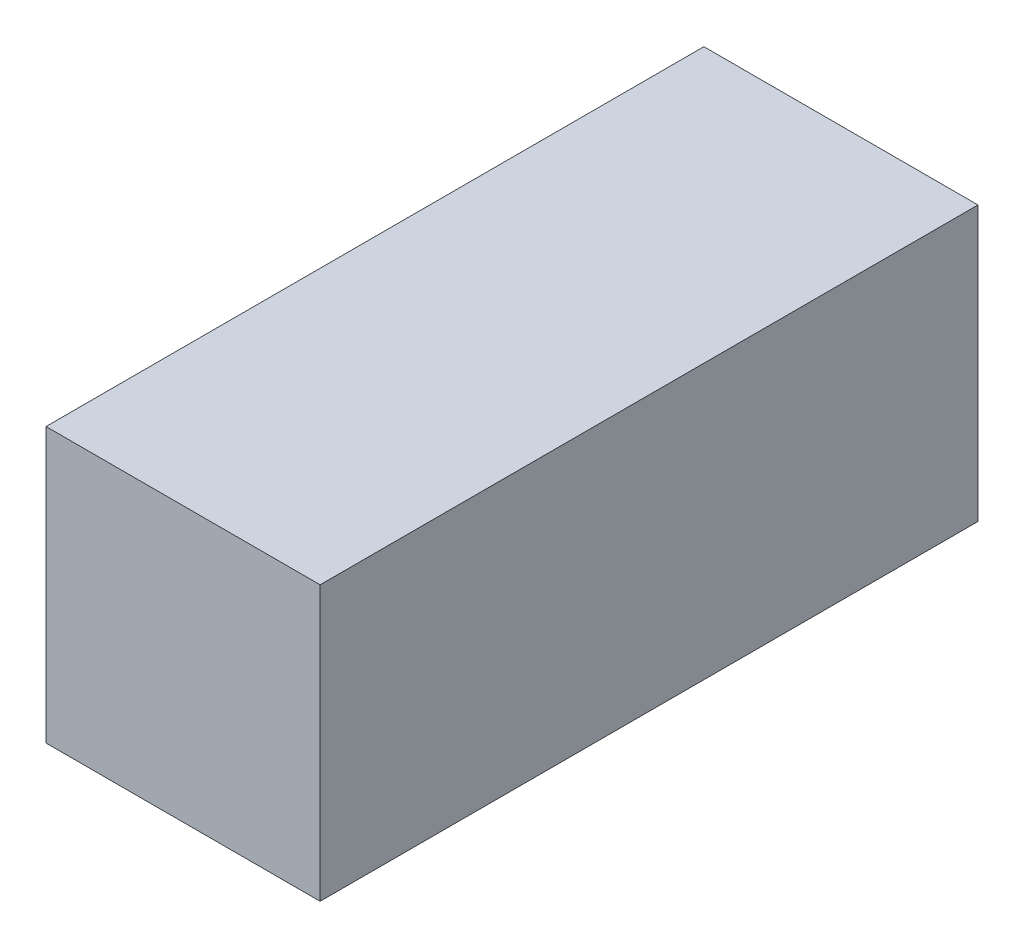
ISO-10303-21;
HEADER;
FILE_DESCRIPTION(('STEP AP214'),'2;1');
FILE_NAME('part.step','',(''),(''),'','','');
FILE_SCHEMA(('AUTOMOTIVE_DESIGN { 1 0 10303 214 1 1 1 1 }'));
ENDSEC;
DATA;
#1=APPLICATION_CONTEXT('core data for automotive mechanical design processes');
#2=APPLICATION_PROTOCOL_DEFINITION('international standard','automotive_design',2000,#1);
#3=PRODUCT_CONTEXT('',#1,'mechanical');
#4=PRODUCT('Part','Part','',(#3));
#5=PRODUCT_RELATED_PRODUCT_CATEGORY('part','',(#4));
#6=PRODUCT_DEFINITION_FORMATION('','',#4);
#7=PRODUCT_DEFINITION_CONTEXT('part definition',#1,'design');
#8=PRODUCT_DEFINITION('design','',#6,#7);
#9=PRODUCT_DEFINITION_SHAPE('','',#8);
#10=(LENGTH_UNIT() NAMED_UNIT(*) SI_UNIT(.MILLI.,.METRE.));
#11=(NAMED_UNIT(*) PLANE_ANGLE_UNIT() SI_UNIT($,.RADIAN.));
#12=(NAMED_UNIT(*) SI_UNIT($,.STERADIAN.) SOLID_ANGLE_UNIT());
#13=UNCERTAINTY_MEASURE_WITH_UNIT(LENGTH_MEASURE(1.E-05),#10,'distance_accuracy_value','');
#14=(GEOMETRIC_REPRESENTATION_CONTEXT(3) GLOBAL_UNCERTAINTY_ASSIGNED_CONTEXT((#13)) GLOBAL_UNIT_ASSIGNED_CONTEXT((#10,
#11,#12)) REPRESENTATION_CONTEXT('',''));
#15=CARTESIAN_POINT('',(0.,0.,0.));
#16=DIRECTION('',(0.,0.,1.));
#17=DIRECTION('',(1.,0.,0.));
#18=AXIS2_PLACEMENT_3D('',#15,#16,#17);
#19=CARTESIAN_POINT('',(5.5,2.5,-17.75));
#20=DIRECTION('',(1.,0.,0.));
#21=DIRECTION('',(0.,0.,-1.));
#22=AXIS2_PLACEMENT_3D('',#19,#20,#21);
#23=PLANE('',#22);
#24=DIRECTION('',(0.,-1.,0.));
#25=VECTOR('',#24,1.);
#26=CARTESIAN_POINT('',(5.5,2.5,-29.75));
#27=LINE('',#26,#25);
#28=CARTESIAN_POINT('',(5.5,2.5,-29.75));
#29=VERTEX_POINT('',#28);
#30=CARTESIAN_POINT('',(5.5,-2.5,-29.75));
#31=VERTEX_POINT('',#30);
#32=EDGE_CURVE('E107',#29,#31,#27,.T.);
#33=ORIENTED_EDGE('',*,*,#32,.T.);
#34=DIRECTION('',(0.,0.,-1.));
#35=VECTOR('',#34,1.);
#36=CARTESIAN_POINT('',(5.5,-2.5,-17.75));
#37=LINE('',#36,#35);
#38=CARTESIAN_POINT('',(5.5,-2.5,-17.75));
#39=VERTEX_POINT('',#38);
#40=EDGE_CURVE('E11',#39,#31,#37,.T.);
#41=ORIENTED_EDGE('',*,*,#40,.F.);
#42=DIRECTION('',(0.,-1.,0.));
#43=VECTOR('',#42,1.);
#44=CARTESIAN_POINT('',(5.5,2.5,-17.75));
#45=LINE('',#44,#43);
#46=CARTESIAN_POINT('',(5.5,2.5,-17.75));
#47=VERTEX_POINT('',#46);
#48=EDGE_CURVE('E90',#47,#39,#45,.T.);
#49=ORIENTED_EDGE('',*,*,#48,.F.);
#50=DIRECTION('',(0.,0.,-1.));
#51=VECTOR('',#50,1.);
#52=CARTESIAN_POINT('',(5.5,2.5,-17.75));
#53=LINE('',#52,#51);
#54=EDGE_CURVE('E103',#47,#29,#53,.T.);
#55=ORIENTED_EDGE('',*,*,#54,.T.);
#56=EDGE_LOOP('',(#33,#41,#49,#55));
#57=FACE_BOUND('',#56,.T.);
#58=ADVANCED_FACE('F38',(#57),#23,.F.);
#59=CARTESIAN_POINT('',(5.5,-2.5,-17.75));
#60=DIRECTION('',(0.,1.,0.));
#61=DIRECTION('',(0.,0.,1.));
#62=AXIS2_PLACEMENT_3D('',#59,#60,#61);
#63=PLANE('',#62);
#64=DIRECTION('',(1.,0.,0.));
#65=VECTOR('',#64,1.);
#66=CARTESIAN_POINT('',(5.5,-2.5,-29.75));
#67=LINE('',#66,#65);
#68=CARTESIAN_POINT('',(10.5,-2.5,-29.75));
#69=VERTEX_POINT('',#68);
#70=EDGE_CURVE('E95',#31,#69,#67,.T.);
#71=ORIENTED_EDGE('',*,*,#70,.T.);
#72=DIRECTION('',(0.,0.,-1.));
#73=VECTOR('',#72,1.);
#74=CARTESIAN_POINT('',(10.5,-2.5,-17.75));
#75=LINE('',#74,#73);
#76=CARTESIAN_POINT('',(10.5,-2.5,-17.75));
#77=VERTEX_POINT('',#76);
#78=EDGE_CURVE('E47',#77,#69,#75,.T.);
#79=ORIENTED_EDGE('',*,*,#78,.F.);
#80=DIRECTION('',(1.,0.,0.));
#81=VECTOR('',#80,1.);
#82=CARTESIAN_POINT('',(5.5,-2.5,-17.75));
#83=LINE('',#82,#81);
#84=EDGE_CURVE('E85',#39,#77,#83,.T.);
#85=ORIENTED_EDGE('',*,*,#84,.F.);
#86=ORIENTED_EDGE('',*,*,#40,.T.);
#87=EDGE_LOOP('',(#71,#79,#85,#86));
#88=FACE_BOUND('',#87,.T.);
#89=ADVANCED_FACE('F94',(#88),#63,.F.);
#90=CARTESIAN_POINT('',(10.5,-2.5,-17.75));
#91=DIRECTION('',(-1.,0.,0.));
#92=DIRECTION('',(0.,0.,1.));
#93=AXIS2_PLACEMENT_3D('',#90,#91,#92);
#94=PLANE('',#93);
#95=DIRECTION('',(0.,1.,0.));
#96=VECTOR('',#95,1.);
#97=CARTESIAN_POINT('',(10.5,-2.5,-29.75));
#98=LINE('',#97,#96);
#99=CARTESIAN_POINT('',(10.5,2.5,-29.75));
#100=VERTEX_POINT('',#99);
#101=EDGE_CURVE('E72',#69,#100,#98,.T.);
#102=ORIENTED_EDGE('',*,*,#101,.T.);
#103=DIRECTION('',(0.,0.,-1.));
#104=VECTOR('',#103,1.);
#105=CARTESIAN_POINT('',(10.5,2.5,-17.75));
#106=LINE('',#105,#104);
#107=CARTESIAN_POINT('',(10.5,2.5,-17.75));
#108=VERTEX_POINT('',#107);
#109=EDGE_CURVE('E97',#108,#100,#106,.T.);
#110=ORIENTED_EDGE('',*,*,#109,.F.);
#111=DIRECTION('',(0.,1.,0.));
#112=VECTOR('',#111,1.);
#113=CARTESIAN_POINT('',(10.5,-2.5,-17.75));
#114=LINE('',#113,#112);
#115=EDGE_CURVE('E88',#77,#108,#114,.T.);
#116=ORIENTED_EDGE('',*,*,#115,.F.);
#117=ORIENTED_EDGE('',*,*,#78,.T.);
#118=EDGE_LOOP('',(#102,#110,#116,#117));
#119=FACE_BOUND('',#118,.T.);
#120=ADVANCED_FACE('F98',(#119),#94,.F.);
#121=CARTESIAN_POINT('',(10.5,2.5,-17.75));
#122=DIRECTION('',(0.,-1.,0.));
#123=DIRECTION('',(0.,0.,-1.));
#124=AXIS2_PLACEMENT_3D('',#121,#122,#123);
#125=PLANE('',#124);
#126=DIRECTION('',(-1.,0.,0.));
#127=VECTOR('',#126,1.);
#128=CARTESIAN_POINT('',(10.5,2.5,-29.75));
#129=LINE('',#128,#127);
#130=EDGE_CURVE('E78',#100,#29,#129,.T.);
#131=ORIENTED_EDGE('',*,*,#130,.T.);
#132=ORIENTED_EDGE('',*,*,#54,.F.);
#133=DIRECTION('',(-1.,0.,0.));
#134=VECTOR('',#133,1.);
#135=CARTESIAN_POINT('',(10.5,2.5,-17.75));
#136=LINE('',#135,#134);
#137=EDGE_CURVE('E55',#108,#47,#136,.T.);
#138=ORIENTED_EDGE('',*,*,#137,.F.);
#139=ORIENTED_EDGE('',*,*,#109,.T.);
#140=EDGE_LOOP('',(#131,#132,#138,#139));
#141=FACE_BOUND('',#140,.T.);
#142=ADVANCED_FACE('F120',(#141),#125,.F.);
#143=CARTESIAN_POINT('',(0.,0.,-17.75));
#144=DIRECTION('',(0.,0.,1.));
#145=DIRECTION('',(1.,0.,0.));
#146=AXIS2_PLACEMENT_3D('',#143,#144,#145);
#147=PLANE('',#146);
#148=ORIENTED_EDGE('',*,*,#48,.T.);
#149=ORIENTED_EDGE('',*,*,#84,.T.);
#150=ORIENTED_EDGE('',*,*,#115,.T.);
#151=ORIENTED_EDGE('',*,*,#137,.T.);
#152=EDGE_LOOP('',(#148,#149,#150,#151));
#153=FACE_BOUND('',#152,.T.);
#154=ADVANCED_FACE('F86',(#153),#147,.T.);
#155=CARTESIAN_POINT('',(0.,0.,-29.75));
#156=DIRECTION('',(0.,0.,1.));
#157=DIRECTION('',(1.,0.,0.));
#158=AXIS2_PLACEMENT_3D('',#155,#156,#157);
#159=PLANE('',#158);
#160=ORIENTED_EDGE('',*,*,#32,.F.);
#161=ORIENTED_EDGE('',*,*,#130,.F.);
#162=ORIENTED_EDGE('',*,*,#101,.F.);
#163=ORIENTED_EDGE('',*,*,#70,.F.);
#164=EDGE_LOOP('',(#160,#161,#162,#163));
#165=FACE_BOUND('',#164,.T.);
#166=ADVANCED_FACE('F123',(#165),#159,.F.);
#167=CLOSED_SHELL('',(#58,#89,#120,#142,#154,#166));
#168=MANIFOLD_SOLID_BREP('B2',#167);
#169=ADVANCED_BREP_SHAPE_REPRESENTATION('',(#18,#168),#14);
#170=SHAPE_DEFINITION_REPRESENTATION(#9,#169);
ENDSEC;
END-ISO-10303-21;
